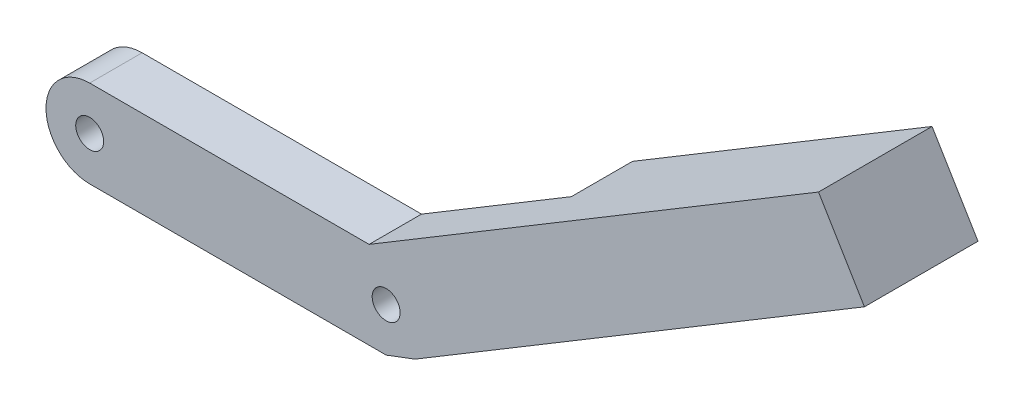
ISO-10303-21;
HEADER;
FILE_DESCRIPTION(('STEP AP214'),'2;1');
FILE_NAME('part.step','',(''),(''),'','','');
FILE_SCHEMA(('AUTOMOTIVE_DESIGN { 1 0 10303 214 1 1 1 1 }'));
ENDSEC;
DATA;
#1=APPLICATION_CONTEXT('core data for automotive mechanical design processes');
#2=APPLICATION_PROTOCOL_DEFINITION('international standard','automotive_design',2000,#1);
#3=PRODUCT_CONTEXT('',#1,'mechanical');
#4=PRODUCT('Part','Part','',(#3));
#5=PRODUCT_RELATED_PRODUCT_CATEGORY('part','',(#4));
#6=PRODUCT_DEFINITION_FORMATION('','',#4);
#7=PRODUCT_DEFINITION_CONTEXT('part definition',#1,'design');
#8=PRODUCT_DEFINITION('design','',#6,#7);
#9=PRODUCT_DEFINITION_SHAPE('','',#8);
#10=(LENGTH_UNIT() NAMED_UNIT(*) SI_UNIT(.MILLI.,.METRE.));
#11=(NAMED_UNIT(*) PLANE_ANGLE_UNIT() SI_UNIT($,.RADIAN.));
#12=(NAMED_UNIT(*) SI_UNIT($,.STERADIAN.) SOLID_ANGLE_UNIT());
#13=UNCERTAINTY_MEASURE_WITH_UNIT(LENGTH_MEASURE(1.E-05),#10,'distance_accuracy_value','');
#14=(GEOMETRIC_REPRESENTATION_CONTEXT(3) GLOBAL_UNCERTAINTY_ASSIGNED_CONTEXT((#13)) GLOBAL_UNIT_ASSIGNED_CONTEXT((#10,
#11,#12)) REPRESENTATION_CONTEXT('',''));
#15=CARTESIAN_POINT('',(0.,0.,0.));
#16=DIRECTION('',(0.,0.,1.));
#17=DIRECTION('',(1.,0.,0.));
#18=AXIS2_PLACEMENT_3D('',#15,#16,#17);
#19=CARTESIAN_POINT('',(5.89562363242973,-15.5969512419142,6.));
#20=DIRECTION('',(0.353581212371453,-0.935403830576897,0.));
#21=DIRECTION('',(0.935403830576898,0.353581212371453,0.));
#22=AXIS2_PLACEMENT_3D('',#19,#20,#21);
#23=PLANE('',#22);
#24=DIRECTION('',(-0.935403830576897,-0.353581212371453,0.));
#25=VECTOR('',#24,1.);
#26=CARTESIAN_POINT('',(5.89562363242973,-15.5969512419142,0.));
#27=LINE('',#26,#25);
#28=CARTESIAN_POINT('',(37.2374122047228,-3.74980326257933,0.));
#29=VERTEX_POINT('',#28);
#30=CARTESIAN_POINT('',(33.93,-5.,0.));
#31=VERTEX_POINT('',#30);
#32=EDGE_CURVE('E145',#29,#31,#27,.T.);
#33=ORIENTED_EDGE('',*,*,#32,.F.);
#34=DIRECTION('',(0.,0.,-1.));
#35=VECTOR('',#34,1.);
#36=CARTESIAN_POINT('',(37.2374122047228,-3.74980326257933,6.));
#37=LINE('',#36,#35);
#38=CARTESIAN_POINT('',(37.2374122047228,-3.74980326257933,6.));
#39=VERTEX_POINT('',#38);
#40=EDGE_CURVE('E11',#39,#29,#37,.T.);
#41=ORIENTED_EDGE('',*,*,#40,.F.);
#42=DIRECTION('',(-0.935403830576897,-0.353581212371453,0.));
#43=VECTOR('',#42,1.);
#44=CARTESIAN_POINT('',(5.89562363242973,-15.5969512419142,6.));
#45=LINE('',#44,#43);
#46=CARTESIAN_POINT('',(33.93,-5.,6.));
#47=VERTEX_POINT('',#46);
#48=EDGE_CURVE('E205',#39,#47,#45,.T.);
#49=ORIENTED_EDGE('',*,*,#48,.T.);
#50=DIRECTION('',(0.,0.,-1.));
#51=VECTOR('',#50,1.);
#52=CARTESIAN_POINT('',(33.93,-5.,6.));
#53=LINE('',#52,#51);
#54=EDGE_CURVE('E91',#47,#31,#53,.T.);
#55=ORIENTED_EDGE('',*,*,#54,.T.);
#56=EDGE_LOOP('',(#33,#41,#49,#55));
#57=FACE_BOUND('',#56,.T.);
#58=ADVANCED_FACE('F43',(#57),#23,.T.);
#59=CARTESIAN_POINT('',(11.5331929336292,-19.1944563654289,6.));
#60=DIRECTION('',(0.515038074910056,-0.857167300702111,0.));
#61=DIRECTION('',(0.857167300702111,0.515038074910056,0.));
#62=AXIS2_PLACEMENT_3D('',#59,#60,#61);
#63=PLANE('',#62);
#64=DIRECTION('',(-0.857167300702111,-0.515038074910056,0.));
#65=VECTOR('',#64,1.);
#66=CARTESIAN_POINT('',(11.5331929336292,-19.1944563654289,0.));
#67=LINE('',#66,#65);
#68=CARTESIAN_POINT('',(54.380758218765,6.55095823562178,0.));
#69=VERTEX_POINT('',#68);
#70=EDGE_CURVE('E148',#69,#29,#67,.T.);
#71=ORIENTED_EDGE('',*,*,#70,.F.);
#72=DIRECTION('',(0.,0.,1.));
#73=VECTOR('',#72,1.);
#74=CARTESIAN_POINT('',(54.380758218765,6.55095823562177,-7.));
#75=LINE('',#74,#73);
#76=CARTESIAN_POINT('',(54.380758218765,6.55095823562177,-7.));
#77=VERTEX_POINT('',#76);
#78=EDGE_CURVE('E58',#77,#69,#75,.T.);
#79=ORIENTED_EDGE('',*,*,#78,.F.);
#80=DIRECTION('',(0.857167300702111,0.515038074910056,0.));
#81=VECTOR('',#80,1.);
#82=CARTESIAN_POINT('',(11.5331929336292,-19.1944563654289,-7.));
#83=LINE('',#82,#81);
#84=CARTESIAN_POINT('',(88.6674502468495,27.152481232024,-7.));
#85=VERTEX_POINT('',#84);
#86=EDGE_CURVE('E180',#77,#85,#83,.T.);
#87=ORIENTED_EDGE('',*,*,#86,.T.);
#88=DIRECTION('',(0.,0.,-1.));
#89=VECTOR('',#88,1.);
#90=CARTESIAN_POINT('',(88.6674502468495,27.152481232024,6.));
#91=LINE('',#90,#89);
#92=CARTESIAN_POINT('',(88.6674502468495,27.152481232024,6.));
#93=VERTEX_POINT('',#92);
#94=EDGE_CURVE('E51',#93,#85,#91,.T.);
#95=ORIENTED_EDGE('',*,*,#94,.F.);
#96=DIRECTION('',(-0.857167300702111,-0.515038074910056,0.));
#97=VECTOR('',#96,1.);
#98=CARTESIAN_POINT('',(11.5331929336292,-19.1944563654289,6.));
#99=LINE('',#98,#97);
#100=EDGE_CURVE('E207',#93,#39,#99,.T.);
#101=ORIENTED_EDGE('',*,*,#100,.T.);
#102=ORIENTED_EDGE('',*,*,#40,.T.);
#103=EDGE_LOOP('',(#71,#79,#87,#95,#101,#102));
#104=FACE_BOUND('',#103,.T.);
#105=ADVANCED_FACE('F182',(#104),#63,.T.);
#106=CARTESIAN_POINT('',(77.1342573132203,46.3469375974529,6.));
#107=DIRECTION('',(-0.857167300702111,-0.515038074910056,0.));
#108=DIRECTION('',(0.515038074910057,-0.857167300702111,0.));
#109=AXIS2_PLACEMENT_3D('',#106,#107,#108);
#110=PLANE('',#109);
#111=ORIENTED_EDGE('',*,*,#94,.T.);
#112=DIRECTION('',(-0.515038074910057,0.85716730070211,0.));
#113=VECTOR('',#112,1.);
#114=CARTESIAN_POINT('',(77.1342573132202,46.346937597453,-7.));
#115=LINE('',#114,#113);
#116=CARTESIAN_POINT('',(83.4100380421267,35.9022844946033,-7.));
#117=VERTEX_POINT('',#116);
#118=EDGE_CURVE('E173',#85,#117,#115,.T.);
#119=ORIENTED_EDGE('',*,*,#118,.T.);
#120=DIRECTION('',(0.,0.,-1.));
#121=VECTOR('',#120,1.);
#122=CARTESIAN_POINT('',(83.4100380421266,35.9022844946034,6.));
#123=LINE('',#122,#121);
#124=CARTESIAN_POINT('',(83.4100380421266,35.9022844946034,6.));
#125=VERTEX_POINT('',#124);
#126=EDGE_CURVE('E162',#125,#117,#123,.T.);
#127=ORIENTED_EDGE('',*,*,#126,.F.);
#128=DIRECTION('',(-0.515038074910057,0.857167300702111,0.));
#129=VECTOR('',#128,1.);
#130=CARTESIAN_POINT('',(77.1342573132203,46.3469375974529,6.));
#131=LINE('',#130,#129);
#132=EDGE_CURVE('E134',#93,#125,#131,.T.);
#133=ORIENTED_EDGE('',*,*,#132,.F.);
#134=EDGE_LOOP('',(#111,#119,#127,#133));
#135=FACE_BOUND('',#134,.T.);
#136=ADVANCED_FACE('F170',(#135),#110,.F.);
#137=CARTESIAN_POINT('',(6.27578072890634,-10.4446531028496,6.));
#138=DIRECTION('',(-0.515038074910056,0.857167300702111,0.));
#139=DIRECTION('',(-0.857167300702111,-0.515038074910056,0.));
#140=AXIS2_PLACEMENT_3D('',#137,#138,#139);
#141=PLANE('',#140);
#142=DIRECTION('',(0.857167300702111,0.515038074910056,0.));
#143=VECTOR('',#142,1.);
#144=CARTESIAN_POINT('',(6.27578072890634,-10.4446531028496,0.));
#145=LINE('',#144,#143);
#146=CARTESIAN_POINT('',(31.98,5.,0.));
#147=VERTEX_POINT('',#146);
#148=CARTESIAN_POINT('',(49.1233460140422,15.3007614982011,0.));
#149=VERTEX_POINT('',#148);
#150=EDGE_CURVE('E150',#147,#149,#145,.T.);
#151=ORIENTED_EDGE('',*,*,#150,.F.);
#152=DIRECTION('',(0.,0.,-1.));
#153=VECTOR('',#152,1.);
#154=CARTESIAN_POINT('',(31.98,5.,6.));
#155=LINE('',#154,#153);
#156=CARTESIAN_POINT('',(31.98,5.,6.));
#157=VERTEX_POINT('',#156);
#158=EDGE_CURVE('E121',#157,#147,#155,.T.);
#159=ORIENTED_EDGE('',*,*,#158,.F.);
#160=DIRECTION('',(0.857167300702111,0.515038074910056,0.));
#161=VECTOR('',#160,1.);
#162=CARTESIAN_POINT('',(6.27578072890634,-10.4446531028496,6.));
#163=LINE('',#162,#161);
#164=EDGE_CURVE('E132',#157,#125,#163,.T.);
#165=ORIENTED_EDGE('',*,*,#164,.T.);
#166=ORIENTED_EDGE('',*,*,#126,.T.);
#167=DIRECTION('',(-0.857167300702111,-0.515038074910056,0.));
#168=VECTOR('',#167,1.);
#169=CARTESIAN_POINT('',(6.27578072890634,-10.4446531028496,-7.));
#170=LINE('',#169,#168);
#171=CARTESIAN_POINT('',(49.1233460140422,15.3007614982011,-7.));
#172=VERTEX_POINT('',#171);
#173=EDGE_CURVE('E190',#117,#172,#170,.T.);
#174=ORIENTED_EDGE('',*,*,#173,.T.);
#175=DIRECTION('',(0.,0.,1.));
#176=VECTOR('',#175,1.);
#177=CARTESIAN_POINT('',(49.1233460140422,15.3007614982011,-7.));
#178=LINE('',#177,#176);
#179=EDGE_CURVE('E191',#172,#149,#178,.T.);
#180=ORIENTED_EDGE('',*,*,#179,.T.);
#181=EDGE_LOOP('',(#151,#159,#165,#166,#174,#180));
#182=FACE_BOUND('',#181,.T.);
#183=ADVANCED_FACE('F210',(#182),#141,.T.);
#184=CARTESIAN_POINT('',(0.,5.,6.));
#185=DIRECTION('',(0.,1.,0.));
#186=DIRECTION('',(0.,0.,1.));
#187=AXIS2_PLACEMENT_3D('',#184,#185,#186);
#188=PLANE('',#187);
#189=DIRECTION('',(1.,0.,0.));
#190=VECTOR('',#189,1.);
#191=CARTESIAN_POINT('',(0.,5.,0.));
#192=LINE('',#191,#190);
#193=CARTESIAN_POINT('',(0.,5.,0.));
#194=VERTEX_POINT('',#193);
#195=EDGE_CURVE('E117',#194,#147,#192,.T.);
#196=ORIENTED_EDGE('',*,*,#195,.F.);
#197=DIRECTION('',(0.,0.,-1.));
#198=VECTOR('',#197,1.);
#199=CARTESIAN_POINT('',(0.,5.,6.));
#200=LINE('',#199,#198);
#201=CARTESIAN_POINT('',(0.,5.,6.));
#202=VERTEX_POINT('',#201);
#203=EDGE_CURVE('E111',#202,#194,#200,.T.);
#204=ORIENTED_EDGE('',*,*,#203,.F.);
#205=DIRECTION('',(1.,0.,0.));
#206=VECTOR('',#205,1.);
#207=CARTESIAN_POINT('',(0.,5.,6.));
#208=LINE('',#207,#206);
#209=EDGE_CURVE('E115',#202,#157,#208,.T.);
#210=ORIENTED_EDGE('',*,*,#209,.T.);
#211=ORIENTED_EDGE('',*,*,#158,.T.);
#212=EDGE_LOOP('',(#196,#204,#210,#211));
#213=FACE_BOUND('',#212,.T.);
#214=ADVANCED_FACE('F113',(#213),#188,.T.);
#215=CARTESIAN_POINT('',(0.,0.,6.));
#216=DIRECTION('',(0.,0.,-1.));
#217=DIRECTION('',(-1.,0.,0.));
#218=AXIS2_PLACEMENT_3D('',#215,#216,#217);
#219=CYLINDRICAL_SURFACE('',#218,5.);
#220=CARTESIAN_POINT('',(0.,0.,0.));
#221=DIRECTION('',(0.,0.,1.));
#222=DIRECTION('',(1.,0.,0.));
#223=AXIS2_PLACEMENT_3D('',#220,#221,#222);
#224=CIRCLE('',#223,5.);
#225=CARTESIAN_POINT('',(0.,-5.,0.));
#226=VERTEX_POINT('',#225);
#227=EDGE_CURVE('E154',#194,#226,#224,.T.);
#228=ORIENTED_EDGE('',*,*,#227,.T.);
#229=DIRECTION('',(0.,0.,-1.));
#230=VECTOR('',#229,1.);
#231=CARTESIAN_POINT('',(0.,-5.,6.));
#232=LINE('',#231,#230);
#233=CARTESIAN_POINT('',(0.,-5.,6.));
#234=VERTEX_POINT('',#233);
#235=EDGE_CURVE('E122',#234,#226,#232,.T.);
#236=ORIENTED_EDGE('',*,*,#235,.F.);
#237=CARTESIAN_POINT('',(0.,0.,6.));
#238=DIRECTION('',(0.,0.,1.));
#239=DIRECTION('',(1.,0.,0.));
#240=AXIS2_PLACEMENT_3D('',#237,#238,#239);
#241=CIRCLE('',#240,5.);
#242=EDGE_CURVE('E125',#202,#234,#241,.T.);
#243=ORIENTED_EDGE('',*,*,#242,.F.);
#244=ORIENTED_EDGE('',*,*,#203,.T.);
#245=EDGE_LOOP('',(#228,#236,#243,#244));
#246=FACE_BOUND('',#245,.T.);
#247=ADVANCED_FACE('F126',(#246),#219,.T.);
#248=CARTESIAN_POINT('',(0.,0.,6.));
#249=DIRECTION('',(0.,0.,-1.));
#250=DIRECTION('',(-1.,0.,0.));
#251=AXIS2_PLACEMENT_3D('',#248,#249,#250);
#252=CYLINDRICAL_SURFACE('',#251,1.6);
#253=CARTESIAN_POINT('',(0.,0.,6.));
#254=DIRECTION('',(0.,0.,1.));
#255=DIRECTION('',(1.,0.,0.));
#256=AXIS2_PLACEMENT_3D('',#253,#254,#255);
#257=CIRCLE('',#256,1.6);
#258=CARTESIAN_POINT('',(1.6,0.,6.));
#259=VERTEX_POINT('',#258);
#260=EDGE_CURVE('E202',#259,#259,#257,.T.);
#261=ORIENTED_EDGE('',*,*,#260,.T.);
#262=EDGE_LOOP('',(#261));
#263=FACE_BOUND('',#262,.T.);
#264=CARTESIAN_POINT('',(0.,0.,0.));
#265=DIRECTION('',(0.,0.,1.));
#266=DIRECTION('',(1.,0.,0.));
#267=AXIS2_PLACEMENT_3D('',#264,#265,#266);
#268=CIRCLE('',#267,1.6);
#269=CARTESIAN_POINT('',(1.6,0.,0.));
#270=VERTEX_POINT('',#269);
#271=EDGE_CURVE('E142',#270,#270,#268,.T.);
#272=ORIENTED_EDGE('',*,*,#271,.F.);
#273=EDGE_LOOP('',(#272));
#274=FACE_BOUND('',#273,.T.);
#275=ADVANCED_FACE('F238',(#263,#274),#252,.F.);
#276=CARTESIAN_POINT('',(33.93,0.,6.));
#277=DIRECTION('',(0.,0.,-1.));
#278=DIRECTION('',(-1.,0.,0.));
#279=AXIS2_PLACEMENT_3D('',#276,#277,#278);
#280=CYLINDRICAL_SURFACE('',#279,1.60000000000001);
#281=CARTESIAN_POINT('',(33.93,0.,6.));
#282=DIRECTION('',(0.,0.,1.));
#283=DIRECTION('',(1.,0.,0.));
#284=AXIS2_PLACEMENT_3D('',#281,#282,#283);
#285=CIRCLE('',#284,1.60000000000001);
#286=CARTESIAN_POINT('',(35.53,0.,6.));
#287=VERTEX_POINT('',#286);
#288=EDGE_CURVE('E158',#287,#287,#285,.T.);
#289=ORIENTED_EDGE('',*,*,#288,.T.);
#290=EDGE_LOOP('',(#289));
#291=FACE_BOUND('',#290,.T.);
#292=CARTESIAN_POINT('',(33.93,0.,0.));
#293=DIRECTION('',(0.,0.,1.));
#294=DIRECTION('',(1.,0.,0.));
#295=AXIS2_PLACEMENT_3D('',#292,#293,#294);
#296=CIRCLE('',#295,1.60000000000001);
#297=CARTESIAN_POINT('',(35.53,0.,0.));
#298=VERTEX_POINT('',#297);
#299=EDGE_CURVE('E139',#298,#298,#296,.T.);
#300=ORIENTED_EDGE('',*,*,#299,.F.);
#301=EDGE_LOOP('',(#300));
#302=FACE_BOUND('',#301,.T.);
#303=ADVANCED_FACE('F45',(#291,#302),#280,.F.);
#304=CARTESIAN_POINT('',(0.,-5.,6.));
#305=DIRECTION('',(0.,1.,0.));
#306=DIRECTION('',(0.,0.,1.));
#307=AXIS2_PLACEMENT_3D('',#304,#305,#306);
#308=PLANE('',#307);
#309=DIRECTION('',(1.,0.,0.));
#310=VECTOR('',#309,1.);
#311=CARTESIAN_POINT('',(0.,-5.,0.));
#312=LINE('',#311,#310);
#313=EDGE_CURVE('E156',#226,#31,#312,.T.);
#314=ORIENTED_EDGE('',*,*,#313,.T.);
#315=ORIENTED_EDGE('',*,*,#54,.F.);
#316=DIRECTION('',(1.,0.,0.));
#317=VECTOR('',#316,1.);
#318=CARTESIAN_POINT('',(0.,-5.,6.));
#319=LINE('',#318,#317);
#320=EDGE_CURVE('E67',#234,#47,#319,.T.);
#321=ORIENTED_EDGE('',*,*,#320,.F.);
#322=ORIENTED_EDGE('',*,*,#235,.T.);
#323=EDGE_LOOP('',(#314,#315,#321,#322));
#324=FACE_BOUND('',#323,.T.);
#325=ADVANCED_FACE('F215',(#324),#308,.F.);
#326=CARTESIAN_POINT('',(0.,0.,6.));
#327=DIRECTION('',(0.,0.,1.));
#328=DIRECTION('',(1.,0.,0.));
#329=AXIS2_PLACEMENT_3D('',#326,#327,#328);
#330=PLANE('',#329);
#331=ORIENTED_EDGE('',*,*,#288,.F.);
#332=EDGE_LOOP('',(#331));
#333=FACE_BOUND('',#332,.T.);
#334=ORIENTED_EDGE('',*,*,#260,.F.);
#335=EDGE_LOOP('',(#334));
#336=FACE_BOUND('',#335,.T.);
#337=ORIENTED_EDGE('',*,*,#48,.F.);
#338=ORIENTED_EDGE('',*,*,#100,.F.);
#339=ORIENTED_EDGE('',*,*,#132,.T.);
#340=ORIENTED_EDGE('',*,*,#164,.F.);
#341=ORIENTED_EDGE('',*,*,#209,.F.);
#342=ORIENTED_EDGE('',*,*,#242,.T.);
#343=ORIENTED_EDGE('',*,*,#320,.T.);
#344=EDGE_LOOP('',(#337,#338,#339,#340,#341,#342,#343));
#345=FACE_BOUND('',#344,.T.);
#346=ADVANCED_FACE('F130',(#333,#336,#345),#330,.T.);
#347=CARTESIAN_POINT('',(0.,0.,0.));
#348=DIRECTION('',(0.,0.,1.));
#349=DIRECTION('',(1.,0.,0.));
#350=AXIS2_PLACEMENT_3D('',#347,#348,#349);
#351=PLANE('',#350);
#352=ORIENTED_EDGE('',*,*,#299,.T.);
#353=EDGE_LOOP('',(#352));
#354=FACE_BOUND('',#353,.T.);
#355=ORIENTED_EDGE('',*,*,#271,.T.);
#356=EDGE_LOOP('',(#355));
#357=FACE_BOUND('',#356,.T.);
#358=ORIENTED_EDGE('',*,*,#150,.T.);
#359=DIRECTION('',(0.515038074910056,-0.857167300702111,0.));
#360=VECTOR('',#359,1.);
#361=CARTESIAN_POINT('',(42.8475652851359,25.7454146010506,0.));
#362=LINE('',#361,#360);
#363=EDGE_CURVE('E197',#149,#69,#362,.T.);
#364=ORIENTED_EDGE('',*,*,#363,.T.);
#365=ORIENTED_EDGE('',*,*,#70,.T.);
#366=ORIENTED_EDGE('',*,*,#32,.T.);
#367=ORIENTED_EDGE('',*,*,#313,.F.);
#368=ORIENTED_EDGE('',*,*,#227,.F.);
#369=ORIENTED_EDGE('',*,*,#195,.T.);
#370=EDGE_LOOP('',(#358,#364,#365,#366,#367,#368,#369));
#371=FACE_BOUND('',#370,.T.);
#372=ADVANCED_FACE('F213',(#354,#357,#371),#351,.F.);
#373=CARTESIAN_POINT('',(42.8475652851359,25.7454146010506,-7.));
#374=DIRECTION('',(-0.857167300702111,-0.515038074910056,0.));
#375=DIRECTION('',(0.515038074910056,-0.857167300702111,0.));
#376=AXIS2_PLACEMENT_3D('',#373,#374,#375);
#377=PLANE('',#376);
#378=ORIENTED_EDGE('',*,*,#363,.F.);
#379=ORIENTED_EDGE('',*,*,#179,.F.);
#380=DIRECTION('',(0.515038074910056,-0.857167300702111,0.));
#381=VECTOR('',#380,1.);
#382=CARTESIAN_POINT('',(42.8475652851359,25.7454146010506,-7.));
#383=LINE('',#382,#381);
#384=EDGE_CURVE('E185',#172,#77,#383,.T.);
#385=ORIENTED_EDGE('',*,*,#384,.T.);
#386=ORIENTED_EDGE('',*,*,#78,.T.);
#387=EDGE_LOOP('',(#378,#379,#385,#386));
#388=FACE_BOUND('',#387,.T.);
#389=ADVANCED_FACE('F216',(#388),#377,.T.);
#390=CARTESIAN_POINT('',(0.,0.,-7.));
#391=DIRECTION('',(0.,0.,1.));
#392=DIRECTION('',(1.,0.,0.));
#393=AXIS2_PLACEMENT_3D('',#390,#391,#392);
#394=PLANE('',#393);
#395=ORIENTED_EDGE('',*,*,#173,.F.);
#396=ORIENTED_EDGE('',*,*,#118,.F.);
#397=ORIENTED_EDGE('',*,*,#86,.F.);
#398=ORIENTED_EDGE('',*,*,#384,.F.);
#399=EDGE_LOOP('',(#395,#396,#397,#398));
#400=FACE_BOUND('',#399,.T.);
#401=ADVANCED_FACE('F188',(#400),#394,.F.);
#402=CLOSED_SHELL('',(#58,#105,#136,#183,#214,#247,#275,#303,#325,#346,#372,#389,#401));
#403=MANIFOLD_SOLID_BREP('B2',#402);
#404=ADVANCED_BREP_SHAPE_REPRESENTATION('',(#18,#403),#14);
#405=SHAPE_DEFINITION_REPRESENTATION(#9,#404);
ENDSEC;
END-ISO-10303-21;
